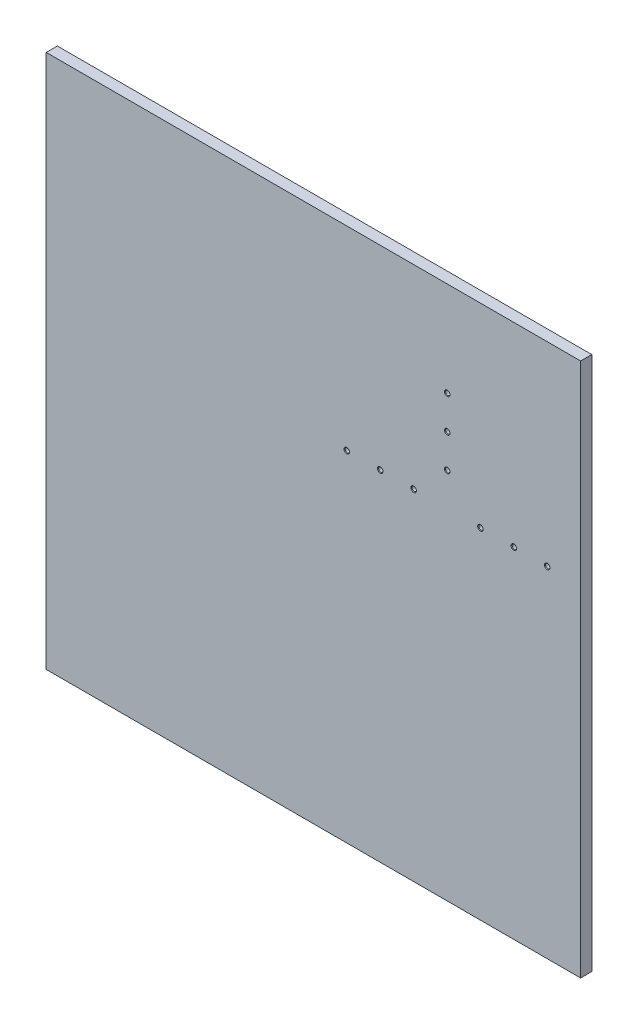
ISO-10303-21;
HEADER;
FILE_DESCRIPTION(('STEP AP214'),'2;1');
FILE_NAME('part.step','',(''),(''),'','','');
FILE_SCHEMA(('AUTOMOTIVE_DESIGN { 1 0 10303 214 1 1 1 1 }'));
ENDSEC;
DATA;
#1=APPLICATION_CONTEXT('core data for automotive mechanical design processes');
#2=APPLICATION_PROTOCOL_DEFINITION('international standard','automotive_design',2000,#1);
#3=PRODUCT_CONTEXT('',#1,'mechanical');
#4=PRODUCT('Part','Part','',(#3));
#5=PRODUCT_RELATED_PRODUCT_CATEGORY('part','',(#4));
#6=PRODUCT_DEFINITION_FORMATION('','',#4);
#7=PRODUCT_DEFINITION_CONTEXT('part definition',#1,'design');
#8=PRODUCT_DEFINITION('design','',#6,#7);
#9=PRODUCT_DEFINITION_SHAPE('','',#8);
#10=(LENGTH_UNIT() NAMED_UNIT(*) SI_UNIT(.MILLI.,.METRE.));
#11=(NAMED_UNIT(*) PLANE_ANGLE_UNIT() SI_UNIT($,.RADIAN.));
#12=(NAMED_UNIT(*) SI_UNIT($,.STERADIAN.) SOLID_ANGLE_UNIT());
#13=UNCERTAINTY_MEASURE_WITH_UNIT(LENGTH_MEASURE(1.E-05),#10,'distance_accuracy_value','');
#14=(GEOMETRIC_REPRESENTATION_CONTEXT(3) GLOBAL_UNCERTAINTY_ASSIGNED_CONTEXT((#13)) GLOBAL_UNIT_ASSIGNED_CONTEXT((#10,
#11,#12)) REPRESENTATION_CONTEXT('',''));
#15=CARTESIAN_POINT('',(0.,0.,0.));
#16=DIRECTION('',(0.,0.,1.));
#17=DIRECTION('',(1.,0.,0.));
#18=AXIS2_PLACEMENT_3D('',#15,#16,#17);
#19=CARTESIAN_POINT('',(91.6608695652174,-92.2130434782609,12.7));
#20=DIRECTION('',(-1.,0.,0.));
#21=DIRECTION('',(0.,0.,1.));
#22=AXIS2_PLACEMENT_3D('',#19,#20,#21);
#23=PLANE('',#22);
#24=DIRECTION('',(0.,1.,0.));
#25=VECTOR('',#24,1.);
#26=CARTESIAN_POINT('',(91.6608695652174,-92.2130434782609,0.));
#27=LINE('',#26,#25);
#28=CARTESIAN_POINT('',(91.6608695652174,-346.213043478261,0.));
#29=VERTEX_POINT('',#28);
#30=CARTESIAN_POINT('',(91.6608695652174,263.386956521739,0.));
#31=VERTEX_POINT('',#30);
#32=EDGE_CURVE('E42',#29,#31,#27,.T.);
#33=ORIENTED_EDGE('',*,*,#32,.T.);
#34=DIRECTION('',(0.,0.,-1.));
#35=VECTOR('',#34,1.);
#36=CARTESIAN_POINT('',(91.6608695652174,263.386956521739,12.7));
#37=LINE('',#36,#35);
#38=CARTESIAN_POINT('',(91.6608695652174,263.386956521739,12.7));
#39=VERTEX_POINT('',#38);
#40=EDGE_CURVE('E193',#39,#31,#37,.T.);
#41=ORIENTED_EDGE('',*,*,#40,.F.);
#42=DIRECTION('',(0.,1.,0.));
#43=VECTOR('',#42,1.);
#44=CARTESIAN_POINT('',(91.6608695652174,-92.2130434782609,12.7));
#45=LINE('',#44,#43);
#46=CARTESIAN_POINT('',(91.6608695652174,-346.213043478261,12.7));
#47=VERTEX_POINT('',#46);
#48=EDGE_CURVE('E11',#47,#39,#45,.T.);
#49=ORIENTED_EDGE('',*,*,#48,.F.);
#50=DIRECTION('',(0.,0.,1.));
#51=VECTOR('',#50,1.);
#52=CARTESIAN_POINT('',(91.6608695652174,-346.213043478261,0.));
#53=LINE('',#52,#51);
#54=EDGE_CURVE('E211',#29,#47,#53,.T.);
#55=ORIENTED_EDGE('',*,*,#54,.F.);
#56=EDGE_LOOP('',(#33,#41,#49,#55));
#57=FACE_BOUND('',#56,.T.);
#58=ADVANCED_FACE('F39',(#57),#23,.F.);
#59=CARTESIAN_POINT('',(0.,0.,12.7));
#60=DIRECTION('',(0.,0.,-1.));
#61=DIRECTION('',(-1.,0.,0.));
#62=AXIS2_PLACEMENT_3D('',#59,#60,#61);
#63=PLANE('',#62);
#64=CARTESIAN_POINT('',(53.5608695652173,41.3909565217391,12.7));
#65=DIRECTION('',(0.,0.,1.));
#66=DIRECTION('',(1.,0.,0.));
#67=AXIS2_PLACEMENT_3D('',#64,#65,#66);
#68=CIRCLE('',#67,3.1623);
#69=CARTESIAN_POINT('',(56.7231695652173,41.3909565217391,12.7));
#70=VERTEX_POINT('',#69);
#71=EDGE_CURVE('E121',#70,#70,#68,.T.);
#72=ORIENTED_EDGE('',*,*,#71,.F.);
#73=EDGE_LOOP('',(#72));
#74=FACE_BOUND('',#73,.T.);
#75=CARTESIAN_POINT('',(15.4608695652173,41.3909565217391,12.7));
#76=DIRECTION('',(0.,0.,1.));
#77=DIRECTION('',(1.,0.,0.));
#78=AXIS2_PLACEMENT_3D('',#75,#76,#77);
#79=CIRCLE('',#78,3.1623);
#80=CARTESIAN_POINT('',(18.6231695652173,41.3909565217391,12.7));
#81=VERTEX_POINT('',#80);
#82=EDGE_CURVE('E114',#81,#81,#79,.T.);
#83=ORIENTED_EDGE('',*,*,#82,.F.);
#84=EDGE_LOOP('',(#83));
#85=FACE_BOUND('',#84,.T.);
#86=CARTESIAN_POINT('',(-22.6391304347827,41.3909565217391,12.7));
#87=DIRECTION('',(0.,0.,1.));
#88=DIRECTION('',(1.,0.,0.));
#89=AXIS2_PLACEMENT_3D('',#86,#87,#88);
#90=CIRCLE('',#89,3.1623);
#91=CARTESIAN_POINT('',(-19.4768304347827,41.3909565217391,12.7));
#92=VERTEX_POINT('',#91);
#93=EDGE_CURVE('E130',#92,#92,#90,.T.);
#94=ORIENTED_EDGE('',*,*,#93,.F.);
#95=EDGE_LOOP('',(#94));
#96=FACE_BOUND('',#95,.T.);
#97=CARTESIAN_POINT('',(-98.8391304347827,41.3909565217391,12.7));
#98=DIRECTION('',(0.,0.,1.));
#99=DIRECTION('',(1.,0.,0.));
#100=AXIS2_PLACEMENT_3D('',#97,#98,#99);
#101=CIRCLE('',#100,3.16229999999999);
#102=CARTESIAN_POINT('',(-95.6768304347827,41.3909565217391,12.7));
#103=VERTEX_POINT('',#102);
#104=EDGE_CURVE('E139',#103,#103,#101,.T.);
#105=ORIENTED_EDGE('',*,*,#104,.F.);
#106=EDGE_LOOP('',(#105));
#107=FACE_BOUND('',#106,.T.);
#108=CARTESIAN_POINT('',(-136.939130434783,41.3909565217391,12.7));
#109=DIRECTION('',(0.,0.,1.));
#110=DIRECTION('',(1.,0.,0.));
#111=AXIS2_PLACEMENT_3D('',#108,#109,#110);
#112=CIRCLE('',#111,3.16230000000001);
#113=CARTESIAN_POINT('',(-133.776830434783,41.3909565217391,12.7));
#114=VERTEX_POINT('',#113);
#115=EDGE_CURVE('E148',#114,#114,#112,.T.);
#116=ORIENTED_EDGE('',*,*,#115,.F.);
#117=EDGE_LOOP('',(#116));
#118=FACE_BOUND('',#117,.T.);
#119=CARTESIAN_POINT('',(-175.039130434783,41.3909565217391,12.7));
#120=DIRECTION('',(0.,0.,1.));
#121=DIRECTION('',(1.,0.,0.));
#122=AXIS2_PLACEMENT_3D('',#119,#120,#121);
#123=CIRCLE('',#122,3.16230000000001);
#124=CARTESIAN_POINT('',(-171.876830434783,41.3909565217391,12.7));
#125=VERTEX_POINT('',#124);
#126=EDGE_CURVE('E157',#125,#125,#123,.T.);
#127=ORIENTED_EDGE('',*,*,#126,.F.);
#128=EDGE_LOOP('',(#127));
#129=FACE_BOUND('',#128,.T.);
#130=CARTESIAN_POINT('',(-60.4851304347827,79.236956521739,12.7));
#131=DIRECTION('',(0.,0.,1.));
#132=DIRECTION('',(1.,0.,0.));
#133=AXIS2_PLACEMENT_3D('',#130,#131,#132);
#134=CIRCLE('',#133,3.1623);
#135=CARTESIAN_POINT('',(-57.3228304347827,79.236956521739,12.7));
#136=VERTEX_POINT('',#135);
#137=EDGE_CURVE('E166',#136,#136,#134,.T.);
#138=ORIENTED_EDGE('',*,*,#137,.F.);
#139=EDGE_LOOP('',(#138));
#140=FACE_BOUND('',#139,.T.);
#141=CARTESIAN_POINT('',(-60.4851304347826,117.336956521739,12.7));
#142=DIRECTION('',(0.,0.,1.));
#143=DIRECTION('',(1.,0.,0.));
#144=AXIS2_PLACEMENT_3D('',#141,#142,#143);
#145=CIRCLE('',#144,3.1623);
#146=CARTESIAN_POINT('',(-57.3228304347826,117.336956521739,12.7));
#147=VERTEX_POINT('',#146);
#148=EDGE_CURVE('E175',#147,#147,#145,.T.);
#149=ORIENTED_EDGE('',*,*,#148,.F.);
#150=EDGE_LOOP('',(#149));
#151=FACE_BOUND('',#150,.T.);
#152=CARTESIAN_POINT('',(-60.4851304347826,155.436956521739,12.7));
#153=DIRECTION('',(0.,0.,1.));
#154=DIRECTION('',(1.,0.,0.));
#155=AXIS2_PLACEMENT_3D('',#152,#153,#154);
#156=CIRCLE('',#155,3.1623);
#157=CARTESIAN_POINT('',(-57.3228304347826,155.436956521739,12.7));
#158=VERTEX_POINT('',#157);
#159=EDGE_CURVE('E184',#158,#158,#156,.T.);
#160=ORIENTED_EDGE('',*,*,#159,.F.);
#161=EDGE_LOOP('',(#160));
#162=FACE_BOUND('',#161,.T.);
#163=ORIENTED_EDGE('',*,*,#48,.T.);
#164=DIRECTION('',(1.,0.,0.));
#165=VECTOR('',#164,1.);
#166=CARTESIAN_POINT('',(-517.939130434783,263.386956521739,12.7));
#167=LINE('',#166,#165);
#168=CARTESIAN_POINT('',(-517.939130434783,263.386956521739,12.7));
#169=VERTEX_POINT('',#168);
#170=EDGE_CURVE('E202',#169,#39,#167,.T.);
#171=ORIENTED_EDGE('',*,*,#170,.F.);
#172=DIRECTION('',(0.,1.,0.));
#173=VECTOR('',#172,1.);
#174=CARTESIAN_POINT('',(-517.939130434783,-92.2130434782609,12.7));
#175=LINE('',#174,#173);
#176=CARTESIAN_POINT('',(-517.939130434783,-346.213043478261,12.7));
#177=VERTEX_POINT('',#176);
#178=EDGE_CURVE('E53',#177,#169,#175,.T.);
#179=ORIENTED_EDGE('',*,*,#178,.F.);
#180=DIRECTION('',(-1.,0.,0.));
#181=VECTOR('',#180,1.);
#182=CARTESIAN_POINT('',(91.6608695652174,-346.213043478261,12.7));
#183=LINE('',#182,#181);
#184=EDGE_CURVE('E213',#47,#177,#183,.T.);
#185=ORIENTED_EDGE('',*,*,#184,.F.);
#186=EDGE_LOOP('',(#163,#171,#179,#185));
#187=FACE_BOUND('',#186,.T.);
#188=ADVANCED_FACE('F226',(#74,#85,#96,#107,#118,#129,#140,#151,#162,#187),#63,.F.);
#189=CARTESIAN_POINT('',(0.,0.,0.));
#190=DIRECTION('',(0.,0.,-1.));
#191=DIRECTION('',(-1.,0.,0.));
#192=AXIS2_PLACEMENT_3D('',#189,#190,#191);
#193=PLANE('',#192);
#194=ORIENTED_EDGE('',*,*,#32,.F.);
#195=DIRECTION('',(1.,0.,0.));
#196=VECTOR('',#195,1.);
#197=CARTESIAN_POINT('',(-517.939130434783,-346.213043478261,0.));
#198=LINE('',#197,#196);
#199=CARTESIAN_POINT('',(-517.939130434783,-346.213043478261,0.));
#200=VERTEX_POINT('',#199);
#201=EDGE_CURVE('E208',#200,#29,#198,.T.);
#202=ORIENTED_EDGE('',*,*,#201,.F.);
#203=DIRECTION('',(0.,-1.,0.));
#204=VECTOR('',#203,1.);
#205=CARTESIAN_POINT('',(-517.939130434783,212.586956521739,0.));
#206=LINE('',#205,#204);
#207=CARTESIAN_POINT('',(-517.939130434783,263.386956521739,0.));
#208=VERTEX_POINT('',#207);
#209=EDGE_CURVE('E215',#208,#200,#206,.T.);
#210=ORIENTED_EDGE('',*,*,#209,.F.);
#211=DIRECTION('',(-1.,0.,0.));
#212=VECTOR('',#211,1.);
#213=CARTESIAN_POINT('',(91.6608695652174,263.386956521739,0.));
#214=LINE('',#213,#212);
#215=EDGE_CURVE('E196',#31,#208,#214,.T.);
#216=ORIENTED_EDGE('',*,*,#215,.F.);
#217=EDGE_LOOP('',(#194,#202,#210,#216));
#218=FACE_BOUND('',#217,.T.);
#219=ADVANCED_FACE('F223',(#218),#193,.T.);
#220=CARTESIAN_POINT('',(-517.939130434783,0.,0.));
#221=DIRECTION('',(-1.,0.,0.));
#222=DIRECTION('',(0.,0.,1.));
#223=AXIS2_PLACEMENT_3D('',#220,#221,#222);
#224=PLANE('',#223);
#225=ORIENTED_EDGE('',*,*,#178,.T.);
#226=DIRECTION('',(0.,0.,1.));
#227=VECTOR('',#226,1.);
#228=CARTESIAN_POINT('',(-517.939130434783,263.386956521739,0.));
#229=LINE('',#228,#227);
#230=EDGE_CURVE('E199',#208,#169,#229,.T.);
#231=ORIENTED_EDGE('',*,*,#230,.F.);
#232=ORIENTED_EDGE('',*,*,#209,.T.);
#233=DIRECTION('',(0.,0.,-1.));
#234=VECTOR('',#233,1.);
#235=CARTESIAN_POINT('',(-517.939130434783,-346.213043478261,12.7));
#236=LINE('',#235,#234);
#237=EDGE_CURVE('E205',#177,#200,#236,.T.);
#238=ORIENTED_EDGE('',*,*,#237,.F.);
#239=EDGE_LOOP('',(#225,#231,#232,#238));
#240=FACE_BOUND('',#239,.T.);
#241=ADVANCED_FACE('F229',(#240),#224,.T.);
#242=CARTESIAN_POINT('',(0.,-346.213043478261,0.));
#243=DIRECTION('',(0.,-1.,0.));
#244=DIRECTION('',(0.,0.,-1.));
#245=AXIS2_PLACEMENT_3D('',#242,#243,#244);
#246=PLANE('',#245);
#247=ORIENTED_EDGE('',*,*,#237,.T.);
#248=ORIENTED_EDGE('',*,*,#201,.T.);
#249=ORIENTED_EDGE('',*,*,#54,.T.);
#250=ORIENTED_EDGE('',*,*,#184,.T.);
#251=EDGE_LOOP('',(#247,#248,#249,#250));
#252=FACE_BOUND('',#251,.T.);
#253=ADVANCED_FACE('F228',(#252),#246,.T.);
#254=CARTESIAN_POINT('',(0.,263.386956521739,0.));
#255=DIRECTION('',(0.,1.,0.));
#256=DIRECTION('',(0.,0.,1.));
#257=AXIS2_PLACEMENT_3D('',#254,#255,#256);
#258=PLANE('',#257);
#259=ORIENTED_EDGE('',*,*,#40,.T.);
#260=ORIENTED_EDGE('',*,*,#215,.T.);
#261=ORIENTED_EDGE('',*,*,#230,.T.);
#262=ORIENTED_EDGE('',*,*,#170,.T.);
#263=EDGE_LOOP('',(#259,#260,#261,#262));
#264=FACE_BOUND('',#263,.T.);
#265=ADVANCED_FACE('F225',(#264),#258,.T.);
#266=CARTESIAN_POINT('',(-60.4851304347826,155.436956521739,4.318));
#267=DIRECTION('',(0.,0.,1.));
#268=DIRECTION('',(1.,0.,0.));
#269=AXIS2_PLACEMENT_3D('',#266,#267,#268);
#270=CONICAL_SURFACE('',#269,2.5273,1.02974425867665);
#271=CARTESIAN_POINT('',(-60.4851304347826,155.436956521739,2.79944495753165));
#272=VERTEX_POINT('',#271);
#273=VERTEX_LOOP('',#272);
#274=FACE_BOUND('',#273,.T.);
#275=CARTESIAN_POINT('',(-60.4851304347826,155.436956521739,4.318));
#276=DIRECTION('',(0.,0.,1.));
#277=DIRECTION('',(1.,0.,0.));
#278=AXIS2_PLACEMENT_3D('',#275,#276,#277);
#279=CIRCLE('',#278,2.5273);
#280=CARTESIAN_POINT('',(-57.9578304347826,155.436956521739,4.318));
#281=VERTEX_POINT('',#280);
#282=EDGE_CURVE('E190',#281,#281,#279,.T.);
#283=ORIENTED_EDGE('',*,*,#282,.T.);
#284=EDGE_LOOP('',(#283));
#285=FACE_BOUND('',#284,.T.);
#286=ADVANCED_FACE('F277',(#274,#285),#270,.F.);
#287=CARTESIAN_POINT('',(-60.4851304347826,155.436956521739,12.7));
#288=DIRECTION('',(0.,0.,1.));
#289=DIRECTION('',(1.,0.,0.));
#290=AXIS2_PLACEMENT_3D('',#287,#288,#289);
#291=CYLINDRICAL_SURFACE('',#290,2.5273);
#292=ORIENTED_EDGE('',*,*,#282,.F.);
#293=EDGE_LOOP('',(#292));
#294=FACE_BOUND('',#293,.T.);
#295=CARTESIAN_POINT('',(-60.4851304347826,155.436956521739,12.065));
#296=DIRECTION('',(0.,0.,1.));
#297=DIRECTION('',(1.,0.,0.));
#298=AXIS2_PLACEMENT_3D('',#295,#296,#297);
#299=CIRCLE('',#298,2.5273);
#300=CARTESIAN_POINT('',(-57.9578304347826,155.436956521739,12.065));
#301=VERTEX_POINT('',#300);
#302=EDGE_CURVE('E187',#301,#301,#299,.T.);
#303=ORIENTED_EDGE('',*,*,#302,.T.);
#304=EDGE_LOOP('',(#303));
#305=FACE_BOUND('',#304,.T.);
#306=ADVANCED_FACE('F267',(#294,#305),#291,.F.);
#307=CARTESIAN_POINT('',(-60.4851304347826,155.436956521739,12.7));
#308=DIRECTION('',(0.,0.,1.));
#309=DIRECTION('',(1.,0.,0.));
#310=AXIS2_PLACEMENT_3D('',#307,#308,#309);
#311=CONICAL_SURFACE('',#310,3.1623,0.785398163397451);
#312=ORIENTED_EDGE('',*,*,#302,.F.);
#313=EDGE_LOOP('',(#312));
#314=FACE_BOUND('',#313,.T.);
#315=ORIENTED_EDGE('',*,*,#159,.T.);
#316=EDGE_LOOP('',(#315));
#317=FACE_BOUND('',#316,.T.);
#318=ADVANCED_FACE('F264',(#314,#317),#311,.F.);
#319=CARTESIAN_POINT('',(-60.4851304347826,117.336956521739,4.318));
#320=DIRECTION('',(0.,0.,1.));
#321=DIRECTION('',(1.,0.,0.));
#322=AXIS2_PLACEMENT_3D('',#319,#320,#321);
#323=CONICAL_SURFACE('',#322,2.5273,1.02974425867665);
#324=CARTESIAN_POINT('',(-60.4851304347826,117.336956521739,2.79944495753165));
#325=VERTEX_POINT('',#324);
#326=VERTEX_LOOP('',#325);
#327=FACE_BOUND('',#326,.T.);
#328=CARTESIAN_POINT('',(-60.4851304347826,117.336956521739,4.318));
#329=DIRECTION('',(0.,0.,1.));
#330=DIRECTION('',(1.,0.,0.));
#331=AXIS2_PLACEMENT_3D('',#328,#329,#330);
#332=CIRCLE('',#331,2.5273);
#333=CARTESIAN_POINT('',(-57.9578304347827,117.336956521739,4.318));
#334=VERTEX_POINT('',#333);
#335=EDGE_CURVE('E181',#334,#334,#332,.T.);
#336=ORIENTED_EDGE('',*,*,#335,.T.);
#337=EDGE_LOOP('',(#336));
#338=FACE_BOUND('',#337,.T.);
#339=ADVANCED_FACE('F266',(#327,#338),#323,.F.);
#340=CARTESIAN_POINT('',(-60.4851304347826,117.336956521739,12.7));
#341=DIRECTION('',(0.,0.,1.));
#342=DIRECTION('',(1.,0.,0.));
#343=AXIS2_PLACEMENT_3D('',#340,#341,#342);
#344=CYLINDRICAL_SURFACE('',#343,2.5273);
#345=ORIENTED_EDGE('',*,*,#335,.F.);
#346=EDGE_LOOP('',(#345));
#347=FACE_BOUND('',#346,.T.);
#348=CARTESIAN_POINT('',(-60.4851304347826,117.336956521739,12.065));
#349=DIRECTION('',(0.,0.,1.));
#350=DIRECTION('',(1.,0.,0.));
#351=AXIS2_PLACEMENT_3D('',#348,#349,#350);
#352=CIRCLE('',#351,2.5273);
#353=CARTESIAN_POINT('',(-57.9578304347827,117.336956521739,12.065));
#354=VERTEX_POINT('',#353);
#355=EDGE_CURVE('E178',#354,#354,#352,.T.);
#356=ORIENTED_EDGE('',*,*,#355,.T.);
#357=EDGE_LOOP('',(#356));
#358=FACE_BOUND('',#357,.T.);
#359=ADVANCED_FACE('F274',(#347,#358),#344,.F.);
#360=CARTESIAN_POINT('',(-60.4851304347826,117.336956521739,12.7));
#361=DIRECTION('',(0.,0.,1.));
#362=DIRECTION('',(1.,0.,0.));
#363=AXIS2_PLACEMENT_3D('',#360,#361,#362);
#364=CONICAL_SURFACE('',#363,3.1623,0.785398163397451);
#365=ORIENTED_EDGE('',*,*,#355,.F.);
#366=EDGE_LOOP('',(#365));
#367=FACE_BOUND('',#366,.T.);
#368=ORIENTED_EDGE('',*,*,#148,.T.);
#369=EDGE_LOOP('',(#368));
#370=FACE_BOUND('',#369,.T.);
#371=ADVANCED_FACE('F318',(#367,#370),#364,.F.);
#372=CARTESIAN_POINT('',(-60.4851304347827,79.236956521739,4.318));
#373=DIRECTION('',(0.,0.,1.));
#374=DIRECTION('',(1.,0.,0.));
#375=AXIS2_PLACEMENT_3D('',#372,#373,#374);
#376=CONICAL_SURFACE('',#375,2.5273,1.02974425867665);
#377=CARTESIAN_POINT('',(-60.4851304347827,79.236956521739,2.79944495753165));
#378=VERTEX_POINT('',#377);
#379=VERTEX_LOOP('',#378);
#380=FACE_BOUND('',#379,.T.);
#381=CARTESIAN_POINT('',(-60.4851304347827,79.236956521739,4.318));
#382=DIRECTION('',(0.,0.,1.));
#383=DIRECTION('',(1.,0.,0.));
#384=AXIS2_PLACEMENT_3D('',#381,#382,#383);
#385=CIRCLE('',#384,2.5273);
#386=CARTESIAN_POINT('',(-57.9578304347827,79.236956521739,4.318));
#387=VERTEX_POINT('',#386);
#388=EDGE_CURVE('E172',#387,#387,#385,.T.);
#389=ORIENTED_EDGE('',*,*,#388,.T.);
#390=EDGE_LOOP('',(#389));
#391=FACE_BOUND('',#390,.T.);
#392=ADVANCED_FACE('F327',(#380,#391),#376,.F.);
#393=CARTESIAN_POINT('',(-60.4851304347827,79.236956521739,12.7));
#394=DIRECTION('',(0.,0.,1.));
#395=DIRECTION('',(1.,0.,0.));
#396=AXIS2_PLACEMENT_3D('',#393,#394,#395);
#397=CYLINDRICAL_SURFACE('',#396,2.5273);
#398=ORIENTED_EDGE('',*,*,#388,.F.);
#399=EDGE_LOOP('',(#398));
#400=FACE_BOUND('',#399,.T.);
#401=CARTESIAN_POINT('',(-60.4851304347827,79.236956521739,12.065));
#402=DIRECTION('',(0.,0.,1.));
#403=DIRECTION('',(1.,0.,0.));
#404=AXIS2_PLACEMENT_3D('',#401,#402,#403);
#405=CIRCLE('',#404,2.5273);
#406=CARTESIAN_POINT('',(-57.9578304347827,79.236956521739,12.065));
#407=VERTEX_POINT('',#406);
#408=EDGE_CURVE('E169',#407,#407,#405,.T.);
#409=ORIENTED_EDGE('',*,*,#408,.T.);
#410=EDGE_LOOP('',(#409));
#411=FACE_BOUND('',#410,.T.);
#412=ADVANCED_FACE('F337',(#400,#411),#397,.F.);
#413=CARTESIAN_POINT('',(-60.4851304347827,79.236956521739,12.7));
#414=DIRECTION('',(0.,0.,1.));
#415=DIRECTION('',(1.,0.,0.));
#416=AXIS2_PLACEMENT_3D('',#413,#414,#415);
#417=CONICAL_SURFACE('',#416,3.1623,0.785398163397451);
#418=ORIENTED_EDGE('',*,*,#408,.F.);
#419=EDGE_LOOP('',(#418));
#420=FACE_BOUND('',#419,.T.);
#421=ORIENTED_EDGE('',*,*,#137,.T.);
#422=EDGE_LOOP('',(#421));
#423=FACE_BOUND('',#422,.T.);
#424=ADVANCED_FACE('F347',(#420,#423),#417,.F.);
#425=CARTESIAN_POINT('',(-175.039130434783,41.3909565217391,4.318));
#426=DIRECTION('',(0.,0.,1.));
#427=DIRECTION('',(1.,0.,0.));
#428=AXIS2_PLACEMENT_3D('',#425,#426,#427);
#429=CONICAL_SURFACE('',#428,2.52730000000001,1.02974425867666);
#430=CARTESIAN_POINT('',(-175.039130434783,41.3909565217391,2.79944495753165));
#431=VERTEX_POINT('',#430);
#432=VERTEX_LOOP('',#431);
#433=FACE_BOUND('',#432,.T.);
#434=CARTESIAN_POINT('',(-175.039130434783,41.3909565217391,4.318));
#435=DIRECTION('',(0.,0.,1.));
#436=DIRECTION('',(1.,0.,0.));
#437=AXIS2_PLACEMENT_3D('',#434,#435,#436);
#438=CIRCLE('',#437,2.52730000000001);
#439=CARTESIAN_POINT('',(-172.511830434783,41.3909565217391,4.318));
#440=VERTEX_POINT('',#439);
#441=EDGE_CURVE('E163',#440,#440,#438,.T.);
#442=ORIENTED_EDGE('',*,*,#441,.T.);
#443=EDGE_LOOP('',(#442));
#444=FACE_BOUND('',#443,.T.);
#445=ADVANCED_FACE('F357',(#433,#444),#429,.F.);
#446=CARTESIAN_POINT('',(-175.039130434783,41.3909565217391,12.7));
#447=DIRECTION('',(0.,0.,1.));
#448=DIRECTION('',(1.,0.,0.));
#449=AXIS2_PLACEMENT_3D('',#446,#447,#448);
#450=CYLINDRICAL_SURFACE('',#449,2.52730000000001);
#451=ORIENTED_EDGE('',*,*,#441,.F.);
#452=EDGE_LOOP('',(#451));
#453=FACE_BOUND('',#452,.T.);
#454=CARTESIAN_POINT('',(-175.039130434783,41.3909565217391,12.065));
#455=DIRECTION('',(0.,0.,1.));
#456=DIRECTION('',(1.,0.,0.));
#457=AXIS2_PLACEMENT_3D('',#454,#455,#456);
#458=CIRCLE('',#457,2.52730000000001);
#459=CARTESIAN_POINT('',(-172.511830434783,41.3909565217391,12.065));
#460=VERTEX_POINT('',#459);
#461=EDGE_CURVE('E160',#460,#460,#458,.T.);
#462=ORIENTED_EDGE('',*,*,#461,.T.);
#463=EDGE_LOOP('',(#462));
#464=FACE_BOUND('',#463,.T.);
#465=ADVANCED_FACE('F367',(#453,#464),#450,.F.);
#466=CARTESIAN_POINT('',(-175.039130434783,41.3909565217391,12.7));
#467=DIRECTION('',(0.,0.,1.));
#468=DIRECTION('',(1.,0.,0.));
#469=AXIS2_PLACEMENT_3D('',#466,#467,#468);
#470=CONICAL_SURFACE('',#469,3.16230000000001,0.785398163397446);
#471=ORIENTED_EDGE('',*,*,#461,.F.);
#472=EDGE_LOOP('',(#471));
#473=FACE_BOUND('',#472,.T.);
#474=ORIENTED_EDGE('',*,*,#126,.T.);
#475=EDGE_LOOP('',(#474));
#476=FACE_BOUND('',#475,.T.);
#477=ADVANCED_FACE('F377',(#473,#476),#470,.F.);
#478=CARTESIAN_POINT('',(-136.939130434783,41.3909565217391,4.318));
#479=DIRECTION('',(0.,0.,1.));
#480=DIRECTION('',(1.,0.,0.));
#481=AXIS2_PLACEMENT_3D('',#478,#479,#480);
#482=CONICAL_SURFACE('',#481,2.52730000000001,1.02974425867666);
#483=CARTESIAN_POINT('',(-136.939130434783,41.3909565217391,2.79944495753165));
#484=VERTEX_POINT('',#483);
#485=VERTEX_LOOP('',#484);
#486=FACE_BOUND('',#485,.T.);
#487=CARTESIAN_POINT('',(-136.939130434783,41.3909565217391,4.318));
#488=DIRECTION('',(0.,0.,1.));
#489=DIRECTION('',(1.,0.,0.));
#490=AXIS2_PLACEMENT_3D('',#487,#488,#489);
#491=CIRCLE('',#490,2.52730000000001);
#492=CARTESIAN_POINT('',(-134.411830434783,41.3909565217391,4.318));
#493=VERTEX_POINT('',#492);
#494=EDGE_CURVE('E154',#493,#493,#491,.T.);
#495=ORIENTED_EDGE('',*,*,#494,.T.);
#496=EDGE_LOOP('',(#495));
#497=FACE_BOUND('',#496,.T.);
#498=ADVANCED_FACE('F387',(#486,#497),#482,.F.);
#499=CARTESIAN_POINT('',(-136.939130434783,41.3909565217391,12.7));
#500=DIRECTION('',(0.,0.,1.));
#501=DIRECTION('',(1.,0.,0.));
#502=AXIS2_PLACEMENT_3D('',#499,#500,#501);
#503=CYLINDRICAL_SURFACE('',#502,2.52730000000001);
#504=ORIENTED_EDGE('',*,*,#494,.F.);
#505=EDGE_LOOP('',(#504));
#506=FACE_BOUND('',#505,.T.);
#507=CARTESIAN_POINT('',(-136.939130434783,41.3909565217391,12.065));
#508=DIRECTION('',(0.,0.,1.));
#509=DIRECTION('',(1.,0.,0.));
#510=AXIS2_PLACEMENT_3D('',#507,#508,#509);
#511=CIRCLE('',#510,2.52730000000001);
#512=CARTESIAN_POINT('',(-134.411830434783,41.3909565217391,12.065));
#513=VERTEX_POINT('',#512);
#514=EDGE_CURVE('E151',#513,#513,#511,.T.);
#515=ORIENTED_EDGE('',*,*,#514,.T.);
#516=EDGE_LOOP('',(#515));
#517=FACE_BOUND('',#516,.T.);
#518=ADVANCED_FACE('F397',(#506,#517),#503,.F.);
#519=CARTESIAN_POINT('',(-136.939130434783,41.3909565217391,12.7));
#520=DIRECTION('',(0.,0.,1.));
#521=DIRECTION('',(1.,0.,0.));
#522=AXIS2_PLACEMENT_3D('',#519,#520,#521);
#523=CONICAL_SURFACE('',#522,3.16230000000001,0.785398163397446);
#524=ORIENTED_EDGE('',*,*,#514,.F.);
#525=EDGE_LOOP('',(#524));
#526=FACE_BOUND('',#525,.T.);
#527=ORIENTED_EDGE('',*,*,#115,.T.);
#528=EDGE_LOOP('',(#527));
#529=FACE_BOUND('',#528,.T.);
#530=ADVANCED_FACE('F407',(#526,#529),#523,.F.);
#531=CARTESIAN_POINT('',(-98.8391304347827,41.3909565217391,4.318));
#532=DIRECTION('',(0.,0.,1.));
#533=DIRECTION('',(1.,0.,0.));
#534=AXIS2_PLACEMENT_3D('',#531,#532,#533);
#535=CONICAL_SURFACE('',#534,2.5273,1.02974425867665);
#536=CARTESIAN_POINT('',(-98.8391304347827,41.3909565217391,2.79944495753165));
#537=VERTEX_POINT('',#536);
#538=VERTEX_LOOP('',#537);
#539=FACE_BOUND('',#538,.T.);
#540=CARTESIAN_POINT('',(-98.8391304347827,41.3909565217391,4.318));
#541=DIRECTION('',(0.,0.,1.));
#542=DIRECTION('',(1.,0.,0.));
#543=AXIS2_PLACEMENT_3D('',#540,#541,#542);
#544=CIRCLE('',#543,2.5273);
#545=CARTESIAN_POINT('',(-96.3118304347827,41.3909565217391,4.318));
#546=VERTEX_POINT('',#545);
#547=EDGE_CURVE('E145',#546,#546,#544,.T.);
#548=ORIENTED_EDGE('',*,*,#547,.T.);
#549=EDGE_LOOP('',(#548));
#550=FACE_BOUND('',#549,.T.);
#551=ADVANCED_FACE('F417',(#539,#550),#535,.F.);
#552=CARTESIAN_POINT('',(-98.8391304347827,41.3909565217391,12.7));
#553=DIRECTION('',(0.,0.,1.));
#554=DIRECTION('',(1.,0.,0.));
#555=AXIS2_PLACEMENT_3D('',#552,#553,#554);
#556=CYLINDRICAL_SURFACE('',#555,2.5273);
#557=ORIENTED_EDGE('',*,*,#547,.F.);
#558=EDGE_LOOP('',(#557));
#559=FACE_BOUND('',#558,.T.);
#560=CARTESIAN_POINT('',(-98.8391304347827,41.3909565217391,12.065));
#561=DIRECTION('',(0.,0.,1.));
#562=DIRECTION('',(1.,0.,0.));
#563=AXIS2_PLACEMENT_3D('',#560,#561,#562);
#564=CIRCLE('',#563,2.5273);
#565=CARTESIAN_POINT('',(-96.3118304347827,41.3909565217391,12.065));
#566=VERTEX_POINT('',#565);
#567=EDGE_CURVE('E142',#566,#566,#564,.T.);
#568=ORIENTED_EDGE('',*,*,#567,.T.);
#569=EDGE_LOOP('',(#568));
#570=FACE_BOUND('',#569,.T.);
#571=ADVANCED_FACE('F427',(#559,#570),#556,.F.);
#572=CARTESIAN_POINT('',(-98.8391304347827,41.3909565217391,12.7));
#573=DIRECTION('',(0.,0.,1.));
#574=DIRECTION('',(1.,0.,0.));
#575=AXIS2_PLACEMENT_3D('',#572,#573,#574);
#576=CONICAL_SURFACE('',#575,3.16229999999999,0.785398163397446);
#577=ORIENTED_EDGE('',*,*,#567,.F.);
#578=EDGE_LOOP('',(#577));
#579=FACE_BOUND('',#578,.T.);
#580=ORIENTED_EDGE('',*,*,#104,.T.);
#581=EDGE_LOOP('',(#580));
#582=FACE_BOUND('',#581,.T.);
#583=ADVANCED_FACE('F437',(#579,#582),#576,.F.);
#584=CARTESIAN_POINT('',(-22.6391304347827,41.3909565217391,4.318));
#585=DIRECTION('',(0.,0.,1.));
#586=DIRECTION('',(1.,0.,0.));
#587=AXIS2_PLACEMENT_3D('',#584,#585,#586);
#588=CONICAL_SURFACE('',#587,2.5273,1.02974425867665);
#589=CARTESIAN_POINT('',(-22.6391304347827,41.3909565217391,2.79944495753165));
#590=VERTEX_POINT('',#589);
#591=VERTEX_LOOP('',#590);
#592=FACE_BOUND('',#591,.T.);
#593=CARTESIAN_POINT('',(-22.6391304347827,41.3909565217391,4.318));
#594=DIRECTION('',(0.,0.,1.));
#595=DIRECTION('',(1.,0.,0.));
#596=AXIS2_PLACEMENT_3D('',#593,#594,#595);
#597=CIRCLE('',#596,2.5273);
#598=CARTESIAN_POINT('',(-20.1118304347827,41.3909565217391,4.318));
#599=VERTEX_POINT('',#598);
#600=EDGE_CURVE('E136',#599,#599,#597,.T.);
#601=ORIENTED_EDGE('',*,*,#600,.T.);
#602=EDGE_LOOP('',(#601));
#603=FACE_BOUND('',#602,.T.);
#604=ADVANCED_FACE('F447',(#592,#603),#588,.F.);
#605=CARTESIAN_POINT('',(-22.6391304347827,41.3909565217391,12.7));
#606=DIRECTION('',(0.,0.,1.));
#607=DIRECTION('',(1.,0.,0.));
#608=AXIS2_PLACEMENT_3D('',#605,#606,#607);
#609=CYLINDRICAL_SURFACE('',#608,2.5273);
#610=ORIENTED_EDGE('',*,*,#600,.F.);
#611=EDGE_LOOP('',(#610));
#612=FACE_BOUND('',#611,.T.);
#613=CARTESIAN_POINT('',(-22.6391304347827,41.3909565217391,12.065));
#614=DIRECTION('',(0.,0.,1.));
#615=DIRECTION('',(1.,0.,0.));
#616=AXIS2_PLACEMENT_3D('',#613,#614,#615);
#617=CIRCLE('',#616,2.5273);
#618=CARTESIAN_POINT('',(-20.1118304347827,41.3909565217391,12.065));
#619=VERTEX_POINT('',#618);
#620=EDGE_CURVE('E133',#619,#619,#617,.T.);
#621=ORIENTED_EDGE('',*,*,#620,.T.);
#622=EDGE_LOOP('',(#621));
#623=FACE_BOUND('',#622,.T.);
#624=ADVANCED_FACE('F457',(#612,#623),#609,.F.);
#625=CARTESIAN_POINT('',(-22.6391304347827,41.3909565217391,12.7));
#626=DIRECTION('',(0.,0.,1.));
#627=DIRECTION('',(1.,0.,0.));
#628=AXIS2_PLACEMENT_3D('',#625,#626,#627);
#629=CONICAL_SURFACE('',#628,3.1623,0.785398163397448);
#630=ORIENTED_EDGE('',*,*,#620,.F.);
#631=EDGE_LOOP('',(#630));
#632=FACE_BOUND('',#631,.T.);
#633=ORIENTED_EDGE('',*,*,#93,.T.);
#634=EDGE_LOOP('',(#633));
#635=FACE_BOUND('',#634,.T.);
#636=ADVANCED_FACE('F467',(#632,#635),#629,.F.);
#637=CARTESIAN_POINT('',(15.4608695652173,41.3909565217391,4.318));
#638=DIRECTION('',(0.,0.,1.));
#639=DIRECTION('',(1.,0.,0.));
#640=AXIS2_PLACEMENT_3D('',#637,#638,#639);
#641=CONICAL_SURFACE('',#640,2.5273,1.02974425867665);
#642=CARTESIAN_POINT('',(15.4608695652173,41.3909565217391,2.79944495753165));
#643=VERTEX_POINT('',#642);
#644=VERTEX_LOOP('',#643);
#645=FACE_BOUND('',#644,.T.);
#646=CARTESIAN_POINT('',(15.4608695652173,41.3909565217391,4.318));
#647=DIRECTION('',(0.,0.,1.));
#648=DIRECTION('',(1.,0.,0.));
#649=AXIS2_PLACEMENT_3D('',#646,#647,#648);
#650=CIRCLE('',#649,2.5273);
#651=CARTESIAN_POINT('',(17.9881695652173,41.3909565217391,4.318));
#652=VERTEX_POINT('',#651);
#653=EDGE_CURVE('E127',#652,#652,#650,.T.);
#654=ORIENTED_EDGE('',*,*,#653,.T.);
#655=EDGE_LOOP('',(#654));
#656=FACE_BOUND('',#655,.T.);
#657=ADVANCED_FACE('F477',(#645,#656),#641,.F.);
#658=CARTESIAN_POINT('',(15.4608695652173,41.3909565217391,12.7));
#659=DIRECTION('',(0.,0.,1.));
#660=DIRECTION('',(1.,0.,0.));
#661=AXIS2_PLACEMENT_3D('',#658,#659,#660);
#662=CYLINDRICAL_SURFACE('',#661,2.5273);
#663=ORIENTED_EDGE('',*,*,#653,.F.);
#664=EDGE_LOOP('',(#663));
#665=FACE_BOUND('',#664,.T.);
#666=CARTESIAN_POINT('',(15.4608695652173,41.3909565217391,12.065));
#667=DIRECTION('',(0.,0.,1.));
#668=DIRECTION('',(1.,0.,0.));
#669=AXIS2_PLACEMENT_3D('',#666,#667,#668);
#670=CIRCLE('',#669,2.5273);
#671=CARTESIAN_POINT('',(17.9881695652173,41.3909565217391,12.065));
#672=VERTEX_POINT('',#671);
#673=EDGE_CURVE('E118',#672,#672,#670,.T.);
#674=ORIENTED_EDGE('',*,*,#673,.T.);
#675=EDGE_LOOP('',(#674));
#676=FACE_BOUND('',#675,.T.);
#677=ADVANCED_FACE('F487',(#665,#676),#662,.F.);
#678=CARTESIAN_POINT('',(15.4608695652173,41.3909565217391,12.7));
#679=DIRECTION('',(0.,0.,1.));
#680=DIRECTION('',(1.,0.,0.));
#681=AXIS2_PLACEMENT_3D('',#678,#679,#680);
#682=CONICAL_SURFACE('',#681,3.1623,0.785398163397448);
#683=ORIENTED_EDGE('',*,*,#673,.F.);
#684=EDGE_LOOP('',(#683));
#685=FACE_BOUND('',#684,.T.);
#686=ORIENTED_EDGE('',*,*,#82,.T.);
#687=EDGE_LOOP('',(#686));
#688=FACE_BOUND('',#687,.T.);
#689=ADVANCED_FACE('F108',(#685,#688),#682,.F.);
#690=CARTESIAN_POINT('',(53.5608695652173,41.3909565217391,4.318));
#691=DIRECTION('',(0.,0.,1.));
#692=DIRECTION('',(1.,0.,0.));
#693=AXIS2_PLACEMENT_3D('',#690,#691,#692);
#694=CONICAL_SURFACE('',#693,2.5273,1.02974425867665);
#695=CARTESIAN_POINT('',(53.5608695652173,41.3909565217391,2.79944495753165));
#696=VERTEX_POINT('',#695);
#697=VERTEX_LOOP('',#696);
#698=FACE_BOUND('',#697,.T.);
#699=CARTESIAN_POINT('',(53.5608695652173,41.3909565217391,4.318));
#700=DIRECTION('',(0.,0.,1.));
#701=DIRECTION('',(1.,0.,0.));
#702=AXIS2_PLACEMENT_3D('',#699,#700,#701);
#703=CIRCLE('',#702,2.5273);
#704=CARTESIAN_POINT('',(56.0881695652173,41.3909565217391,4.318));
#705=VERTEX_POINT('',#704);
#706=EDGE_CURVE('E112',#705,#705,#703,.T.);
#707=ORIENTED_EDGE('',*,*,#706,.T.);
#708=EDGE_LOOP('',(#707));
#709=FACE_BOUND('',#708,.T.);
#710=ADVANCED_FACE('F104',(#698,#709),#694,.F.);
#711=CARTESIAN_POINT('',(53.5608695652173,41.3909565217391,12.7));
#712=DIRECTION('',(0.,0.,1.));
#713=DIRECTION('',(1.,0.,0.));
#714=AXIS2_PLACEMENT_3D('',#711,#712,#713);
#715=CYLINDRICAL_SURFACE('',#714,2.5273);
#716=ORIENTED_EDGE('',*,*,#706,.F.);
#717=EDGE_LOOP('',(#716));
#718=FACE_BOUND('',#717,.T.);
#719=CARTESIAN_POINT('',(53.5608695652173,41.3909565217391,12.065));
#720=DIRECTION('',(0.,0.,1.));
#721=DIRECTION('',(1.,0.,0.));
#722=AXIS2_PLACEMENT_3D('',#719,#720,#721);
#723=CIRCLE('',#722,2.5273);
#724=CARTESIAN_POINT('',(56.0881695652173,41.3909565217391,12.065));
#725=VERTEX_POINT('',#724);
#726=EDGE_CURVE('E115',#725,#725,#723,.T.);
#727=ORIENTED_EDGE('',*,*,#726,.T.);
#728=EDGE_LOOP('',(#727));
#729=FACE_BOUND('',#728,.T.);
#730=ADVANCED_FACE('F107',(#718,#729),#715,.F.);
#731=CARTESIAN_POINT('',(53.5608695652173,41.3909565217391,12.7));
#732=DIRECTION('',(0.,0.,1.));
#733=DIRECTION('',(1.,0.,0.));
#734=AXIS2_PLACEMENT_3D('',#731,#732,#733);
#735=CONICAL_SURFACE('',#734,3.1623,0.785398163397451);
#736=ORIENTED_EDGE('',*,*,#726,.F.);
#737=EDGE_LOOP('',(#736));
#738=FACE_BOUND('',#737,.T.);
#739=ORIENTED_EDGE('',*,*,#71,.T.);
#740=EDGE_LOOP('',(#739));
#741=FACE_BOUND('',#740,.T.);
#742=ADVANCED_FACE('F521',(#738,#741),#735,.F.);
#743=CLOSED_SHELL('',(#58,#188,#219,#241,#253,#265,#286,#306,#318,#339,#359,#371,#392,#412,#424,
#445,#465,#477,#498,#518,#530,#551,#571,#583,#604,#624,#636,#657,#677,#689,#710,#730,#742));
#744=MANIFOLD_SOLID_BREP('B2',#743);
#745=ADVANCED_BREP_SHAPE_REPRESENTATION('',(#18,#744),#14);
#746=SHAPE_DEFINITION_REPRESENTATION(#9,#745);
ENDSEC;
END-ISO-10303-21;
